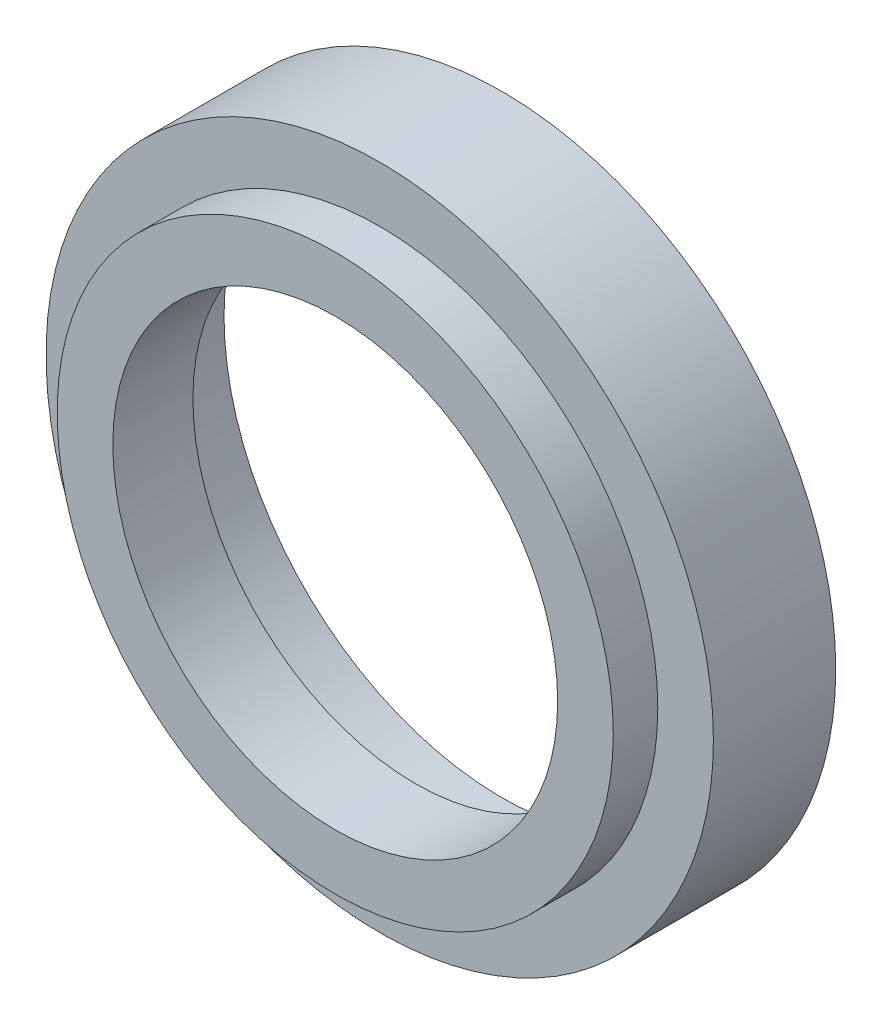
ISO-10303-21;
HEADER;
FILE_DESCRIPTION(('STEP AP214'),'2;1');
FILE_NAME('part.step','',(''),(''),'','','');
FILE_SCHEMA(('AUTOMOTIVE_DESIGN { 1 0 10303 214 1 1 1 1 }'));
ENDSEC;
DATA;
#1=APPLICATION_CONTEXT('core data for automotive mechanical design processes');
#2=APPLICATION_PROTOCOL_DEFINITION('international standard','automotive_design',2000,#1);
#3=PRODUCT_CONTEXT('',#1,'mechanical');
#4=PRODUCT('Part','Part','',(#3));
#5=PRODUCT_RELATED_PRODUCT_CATEGORY('part','',(#4));
#6=PRODUCT_DEFINITION_FORMATION('','',#4);
#7=PRODUCT_DEFINITION_CONTEXT('part definition',#1,'design');
#8=PRODUCT_DEFINITION('design','',#6,#7);
#9=PRODUCT_DEFINITION_SHAPE('','',#8);
#10=(LENGTH_UNIT() NAMED_UNIT(*) SI_UNIT(.MILLI.,.METRE.));
#11=(NAMED_UNIT(*) PLANE_ANGLE_UNIT() SI_UNIT($,.RADIAN.));
#12=(NAMED_UNIT(*) SI_UNIT($,.STERADIAN.) SOLID_ANGLE_UNIT());
#13=UNCERTAINTY_MEASURE_WITH_UNIT(LENGTH_MEASURE(1.E-05),#10,'distance_accuracy_value','');
#14=(GEOMETRIC_REPRESENTATION_CONTEXT(3) GLOBAL_UNCERTAINTY_ASSIGNED_CONTEXT((#13)) GLOBAL_UNIT_ASSIGNED_CONTEXT((#10,
#11,#12)) REPRESENTATION_CONTEXT('',''));
#15=CARTESIAN_POINT('',(0.,0.,0.));
#16=DIRECTION('',(0.,0.,1.));
#17=DIRECTION('',(1.,0.,0.));
#18=AXIS2_PLACEMENT_3D('',#15,#16,#17);
#19=CARTESIAN_POINT('',(0.,0.,7.5));
#20=DIRECTION('',(0.,0.,-1.));
#21=DIRECTION('',(-1.,0.,0.));
#22=AXIS2_PLACEMENT_3D('',#19,#20,#21);
#23=CYLINDRICAL_SURFACE('',#22,15.);
#24=CARTESIAN_POINT('',(0.,0.,0.));
#25=DIRECTION('',(0.,0.,1.));
#26=DIRECTION('',(1.,0.,0.));
#27=AXIS2_PLACEMENT_3D('',#24,#25,#26);
#28=CIRCLE('',#27,15.);
#29=CARTESIAN_POINT('',(15.,0.,0.));
#30=VERTEX_POINT('',#29);
#31=EDGE_CURVE('E10',#30,#30,#28,.T.);
#32=ORIENTED_EDGE('',*,*,#31,.T.);
#33=EDGE_LOOP('',(#32));
#34=FACE_BOUND('',#33,.T.);
#35=CARTESIAN_POINT('',(0.,0.,5.5));
#36=DIRECTION('',(0.,0.,1.));
#37=DIRECTION('',(1.,0.,0.));
#38=AXIS2_PLACEMENT_3D('',#35,#36,#37);
#39=CIRCLE('',#38,15.);
#40=CARTESIAN_POINT('',(15.,0.,5.5));
#41=VERTEX_POINT('',#40);
#42=EDGE_CURVE('E38',#41,#41,#39,.T.);
#43=ORIENTED_EDGE('',*,*,#42,.F.);
#44=EDGE_LOOP('',(#43));
#45=FACE_BOUND('',#44,.T.);
#46=ADVANCED_FACE('F35',(#34,#45),#23,.T.);
#47=CARTESIAN_POINT('',(0.,0.,0.));
#48=DIRECTION('',(0.,0.,1.));
#49=DIRECTION('',(1.,0.,0.));
#50=AXIS2_PLACEMENT_3D('',#47,#48,#49);
#51=PLANE('',#50);
#52=CARTESIAN_POINT('',(0.,0.,0.));
#53=DIRECTION('',(0.,0.,-1.));
#54=DIRECTION('',(-1.,0.,0.));
#55=AXIS2_PLACEMENT_3D('',#52,#53,#54);
#56=CIRCLE('',#55,12.5);
#57=CARTESIAN_POINT('',(-12.5,0.,0.));
#58=VERTEX_POINT('',#57);
#59=EDGE_CURVE('E46',#58,#58,#56,.T.);
#60=ORIENTED_EDGE('',*,*,#59,.F.);
#61=EDGE_LOOP('',(#60));
#62=FACE_BOUND('',#61,.T.);
#63=ORIENTED_EDGE('',*,*,#31,.F.);
#64=EDGE_LOOP('',(#63));
#65=FACE_BOUND('',#64,.T.);
#66=ADVANCED_FACE('F85',(#62,#65),#51,.F.);
#67=CARTESIAN_POINT('',(0.,0.,3.9));
#68=DIRECTION('',(0.,0.,-1.));
#69=DIRECTION('',(-1.,0.,0.));
#70=AXIS2_PLACEMENT_3D('',#67,#68,#69);
#71=CYLINDRICAL_SURFACE('',#70,12.5);
#72=CARTESIAN_POINT('',(0.,0.,3.9));
#73=DIRECTION('',(0.,0.,-1.));
#74=DIRECTION('',(-1.,0.,0.));
#75=AXIS2_PLACEMENT_3D('',#72,#73,#74);
#76=CIRCLE('',#75,12.5);
#77=CARTESIAN_POINT('',(-12.5,0.,3.9));
#78=VERTEX_POINT('',#77);
#79=EDGE_CURVE('E42',#78,#78,#76,.T.);
#80=ORIENTED_EDGE('',*,*,#79,.F.);
#81=EDGE_LOOP('',(#80));
#82=FACE_BOUND('',#81,.T.);
#83=ORIENTED_EDGE('',*,*,#59,.T.);
#84=EDGE_LOOP('',(#83));
#85=FACE_BOUND('',#84,.T.);
#86=ADVANCED_FACE('F89',(#82,#85),#71,.F.);
#87=CARTESIAN_POINT('',(0.,0.,3.9));
#88=DIRECTION('',(0.,0.,-1.));
#89=DIRECTION('',(-1.,0.,0.));
#90=AXIS2_PLACEMENT_3D('',#87,#88,#89);
#91=PLANE('',#90);
#92=CARTESIAN_POINT('',(0.,0.,3.9));
#93=DIRECTION('',(0.,0.,-1.));
#94=DIRECTION('',(-1.,0.,0.));
#95=AXIS2_PLACEMENT_3D('',#92,#93,#94);
#96=CIRCLE('',#95,10.);
#97=CARTESIAN_POINT('',(-10.,0.,3.9));
#98=VERTEX_POINT('',#97);
#99=EDGE_CURVE('E55',#98,#98,#96,.T.);
#100=ORIENTED_EDGE('',*,*,#99,.F.);
#101=EDGE_LOOP('',(#100));
#102=FACE_BOUND('',#101,.T.);
#103=ORIENTED_EDGE('',*,*,#79,.T.);
#104=EDGE_LOOP('',(#103));
#105=FACE_BOUND('',#104,.T.);
#106=ADVANCED_FACE('F80',(#102,#105),#91,.T.);
#107=CARTESIAN_POINT('',(0.,0.,5.5));
#108=DIRECTION('',(0.,0.,1.));
#109=DIRECTION('',(1.,0.,0.));
#110=AXIS2_PLACEMENT_3D('',#107,#108,#109);
#111=PLANE('',#110);
#112=CARTESIAN_POINT('',(0.,0.,5.5));
#113=DIRECTION('',(0.,0.,1.));
#114=DIRECTION('',(1.,0.,0.));
#115=AXIS2_PLACEMENT_3D('',#112,#113,#114);
#116=CIRCLE('',#115,12.5);
#117=CARTESIAN_POINT('',(12.5,0.,5.5));
#118=VERTEX_POINT('',#117);
#119=EDGE_CURVE('E54',#118,#118,#116,.T.);
#120=ORIENTED_EDGE('',*,*,#119,.F.);
#121=EDGE_LOOP('',(#120));
#122=FACE_BOUND('',#121,.T.);
#123=ORIENTED_EDGE('',*,*,#42,.T.);
#124=EDGE_LOOP('',(#123));
#125=FACE_BOUND('',#124,.T.);
#126=ADVANCED_FACE('F74',(#122,#125),#111,.T.);
#127=CARTESIAN_POINT('',(0.,0.,5.5));
#128=DIRECTION('',(0.,0.,1.));
#129=DIRECTION('',(1.,0.,0.));
#130=AXIS2_PLACEMENT_3D('',#127,#128,#129);
#131=CYLINDRICAL_SURFACE('',#130,12.5);
#132=ORIENTED_EDGE('',*,*,#119,.T.);
#133=EDGE_LOOP('',(#132));
#134=FACE_BOUND('',#133,.T.);
#135=CARTESIAN_POINT('',(0.,0.,7.5));
#136=DIRECTION('',(0.,0.,1.));
#137=DIRECTION('',(1.,0.,0.));
#138=AXIS2_PLACEMENT_3D('',#135,#136,#137);
#139=CIRCLE('',#138,12.5);
#140=CARTESIAN_POINT('',(12.5,0.,7.5));
#141=VERTEX_POINT('',#140);
#142=EDGE_CURVE('E51',#141,#141,#139,.T.);
#143=ORIENTED_EDGE('',*,*,#142,.F.);
#144=EDGE_LOOP('',(#143));
#145=FACE_BOUND('',#144,.T.);
#146=ADVANCED_FACE('F69',(#134,#145),#131,.T.);
#147=CARTESIAN_POINT('',(0.,0.,7.5));
#148=DIRECTION('',(0.,0.,1.));
#149=DIRECTION('',(1.,0.,0.));
#150=AXIS2_PLACEMENT_3D('',#147,#148,#149);
#151=PLANE('',#150);
#152=CARTESIAN_POINT('',(0.,0.,7.5));
#153=DIRECTION('',(0.,0.,1.));
#154=DIRECTION('',(1.,0.,0.));
#155=AXIS2_PLACEMENT_3D('',#152,#153,#154);
#156=CIRCLE('',#155,10.);
#157=CARTESIAN_POINT('',(10.,0.,7.5));
#158=VERTEX_POINT('',#157);
#159=EDGE_CURVE('E60',#158,#158,#156,.T.);
#160=ORIENTED_EDGE('',*,*,#159,.F.);
#161=EDGE_LOOP('',(#160));
#162=FACE_BOUND('',#161,.T.);
#163=ORIENTED_EDGE('',*,*,#142,.T.);
#164=EDGE_LOOP('',(#163));
#165=FACE_BOUND('',#164,.T.);
#166=ADVANCED_FACE('F66',(#162,#165),#151,.T.);
#167=CARTESIAN_POINT('',(0.,0.,2.5));
#168=DIRECTION('',(0.,0.,1.));
#169=DIRECTION('',(1.,0.,0.));
#170=AXIS2_PLACEMENT_3D('',#167,#168,#169);
#171=CYLINDRICAL_SURFACE('',#170,10.);
#172=ORIENTED_EDGE('',*,*,#99,.T.);
#173=EDGE_LOOP('',(#172));
#174=FACE_BOUND('',#173,.T.);
#175=ORIENTED_EDGE('',*,*,#159,.T.);
#176=EDGE_LOOP('',(#175));
#177=FACE_BOUND('',#176,.T.);
#178=ADVANCED_FACE('F64',(#174,#177),#171,.F.);
#179=CLOSED_SHELL('',(#46,#66,#86,#106,#126,#146,#166,#178));
#180=MANIFOLD_SOLID_BREP('B2',#179);
#181=ADVANCED_BREP_SHAPE_REPRESENTATION('',(#18,#180),#14);
#182=SHAPE_DEFINITION_REPRESENTATION(#9,#181);
ENDSEC;
END-ISO-10303-21;
